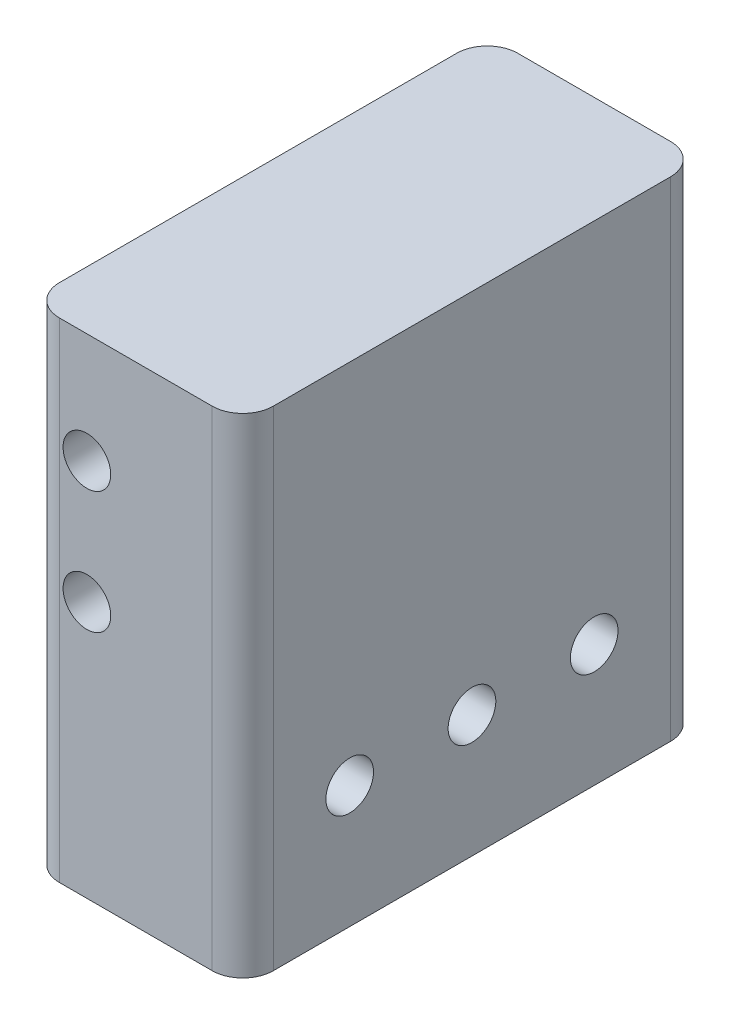
ISO-10303-21;
HEADER;
FILE_DESCRIPTION(('STEP AP214'),'2;1');
FILE_NAME('part.step','',(''),(''),'','','');
FILE_SCHEMA(('AUTOMOTIVE_DESIGN { 1 0 10303 214 1 1 1 1 }'));
ENDSEC;
DATA;
#1=APPLICATION_CONTEXT('core data for automotive mechanical design processes');
#2=APPLICATION_PROTOCOL_DEFINITION('international standard','automotive_design',2000,#1);
#3=PRODUCT_CONTEXT('',#1,'mechanical');
#4=PRODUCT('Part','Part','',(#3));
#5=PRODUCT_RELATED_PRODUCT_CATEGORY('part','',(#4));
#6=PRODUCT_DEFINITION_FORMATION('','',#4);
#7=PRODUCT_DEFINITION_CONTEXT('part definition',#1,'design');
#8=PRODUCT_DEFINITION('design','',#6,#7);
#9=PRODUCT_DEFINITION_SHAPE('','',#8);
#10=(LENGTH_UNIT() NAMED_UNIT(*) SI_UNIT(.MILLI.,.METRE.));
#11=(NAMED_UNIT(*) PLANE_ANGLE_UNIT() SI_UNIT($,.RADIAN.));
#12=(NAMED_UNIT(*) SI_UNIT($,.STERADIAN.) SOLID_ANGLE_UNIT());
#13=UNCERTAINTY_MEASURE_WITH_UNIT(LENGTH_MEASURE(1.E-05),#10,'distance_accuracy_value','');
#14=(GEOMETRIC_REPRESENTATION_CONTEXT(3) GLOBAL_UNCERTAINTY_ASSIGNED_CONTEXT((#13)) GLOBAL_UNIT_ASSIGNED_CONTEXT((#10,
#11,#12)) REPRESENTATION_CONTEXT('',''));
#15=CARTESIAN_POINT('',(0.,0.,0.));
#16=DIRECTION('',(0.,0.,1.));
#17=DIRECTION('',(1.,0.,0.));
#18=AXIS2_PLACEMENT_3D('',#15,#16,#17);
#19=CARTESIAN_POINT('',(23.8125,50.8,-49.2124999999999));
#20=DIRECTION('',(0.,0.,1.));
#21=DIRECTION('',(1.,0.,0.));
#22=AXIS2_PLACEMENT_3D('',#19,#20,#21);
#23=PLANE('',#22);
#24=CARTESIAN_POINT('',(7.62,26.67,-49.2124999999999));
#25=DIRECTION('',(0.,0.,1.));
#26=DIRECTION('',(1.,0.,0.));
#27=AXIS2_PLACEMENT_3D('',#24,#25,#26);
#28=CIRCLE('',#27,2.4765);
#29=CARTESIAN_POINT('',(10.0965,26.67,-49.2124999999999));
#30=VERTEX_POINT('',#29);
#31=EDGE_CURVE('E175',#30,#30,#28,.F.);
#32=ORIENTED_EDGE('',*,*,#31,.F.);
#33=EDGE_LOOP('',(#32));
#34=FACE_BOUND('',#33,.T.);
#35=CARTESIAN_POINT('',(7.62,39.37,-49.2124999999999));
#36=DIRECTION('',(0.,0.,1.));
#37=DIRECTION('',(1.,0.,0.));
#38=AXIS2_PLACEMENT_3D('',#35,#36,#37);
#39=CIRCLE('',#38,2.4765);
#40=CARTESIAN_POINT('',(10.0965,39.37,-49.2124999999999));
#41=VERTEX_POINT('',#40);
#42=EDGE_CURVE('E250',#41,#41,#39,.F.);
#43=ORIENTED_EDGE('',*,*,#42,.F.);
#44=EDGE_LOOP('',(#43));
#45=FACE_BOUND('',#44,.T.);
#46=DIRECTION('',(-1.,0.,0.));
#47=VECTOR('',#46,1.);
#48=CARTESIAN_POINT('',(23.8125,0.,-49.2124999999999));
#49=LINE('',#48,#47);
#50=CARTESIAN_POINT('',(20.6375,0.,-49.2124999999999));
#51=VERTEX_POINT('',#50);
#52=CARTESIAN_POINT('',(4.76249999999999,0.,-49.2124999999999));
#53=VERTEX_POINT('',#52);
#54=EDGE_CURVE('E166',#51,#53,#49,.T.);
#55=ORIENTED_EDGE('',*,*,#54,.T.);
#56=DIRECTION('',(0.,1.,0.));
#57=VECTOR('',#56,1.);
#58=CARTESIAN_POINT('',(4.76249999999999,50.8,-49.2124999999999));
#59=LINE('',#58,#57);
#60=CARTESIAN_POINT('',(4.76249999999999,50.8,-49.2124999999999));
#61=VERTEX_POINT('',#60);
#62=EDGE_CURVE('E122',#53,#61,#59,.T.);
#63=ORIENTED_EDGE('',*,*,#62,.T.);
#64=DIRECTION('',(-1.,0.,0.));
#65=VECTOR('',#64,1.);
#66=CARTESIAN_POINT('',(23.8125,50.8,-49.2124999999999));
#67=LINE('',#66,#65);
#68=CARTESIAN_POINT('',(20.6375,50.8,-49.2124999999999));
#69=VERTEX_POINT('',#68);
#70=EDGE_CURVE('E106',#69,#61,#67,.T.);
#71=ORIENTED_EDGE('',*,*,#70,.F.);
#72=DIRECTION('',(0.,1.,0.));
#73=VECTOR('',#72,1.);
#74=CARTESIAN_POINT('',(20.6375,50.8,-49.2124999999999));
#75=LINE('',#74,#73);
#76=EDGE_CURVE('E119',#69,#51,#75,.F.);
#77=ORIENTED_EDGE('',*,*,#76,.T.);
#78=EDGE_LOOP('',(#55,#63,#71,#77));
#79=FACE_BOUND('',#78,.T.);
#80=ADVANCED_FACE('F37',(#34,#45,#79),#23,.F.);
#81=CARTESIAN_POINT('',(23.8125,50.8,-49.2124999999999));
#82=DIRECTION('',(0.,-1.,0.));
#83=DIRECTION('',(0.,0.,-1.));
#84=AXIS2_PLACEMENT_3D('',#81,#82,#83);
#85=PLANE('',#84);
#86=ORIENTED_EDGE('',*,*,#70,.T.);
#87=CARTESIAN_POINT('',(4.76249999999999,50.8,-46.0374999999999));
#88=DIRECTION('',(0.,-1.,0.));
#89=DIRECTION('',(0.,0.,-1.));
#90=AXIS2_PLACEMENT_3D('',#87,#88,#89);
#91=CIRCLE('',#90,3.175);
#92=CARTESIAN_POINT('',(1.58749999999999,50.8,-46.0374999999999));
#93=VERTEX_POINT('',#92);
#94=EDGE_CURVE('E113',#61,#93,#91,.F.);
#95=ORIENTED_EDGE('',*,*,#94,.T.);
#96=DIRECTION('',(0.,0.,1.));
#97=VECTOR('',#96,1.);
#98=CARTESIAN_POINT('',(1.58749999999999,50.8,-49.2124999999999));
#99=LINE('',#98,#97);
#100=CARTESIAN_POINT('',(1.5875,50.8,-4.7625));
#101=VERTEX_POINT('',#100);
#102=EDGE_CURVE('E173',#93,#101,#99,.T.);
#103=ORIENTED_EDGE('',*,*,#102,.T.);
#104=CARTESIAN_POINT('',(4.7625,50.8,-4.76250000000001));
#105=DIRECTION('',(0.,-1.,0.));
#106=DIRECTION('',(0.,0.,-1.));
#107=AXIS2_PLACEMENT_3D('',#104,#105,#106);
#108=CIRCLE('',#107,3.175);
#109=CARTESIAN_POINT('',(4.7625,50.8,-1.58750000000001));
#110=VERTEX_POINT('',#109);
#111=EDGE_CURVE('E114',#101,#110,#108,.F.);
#112=ORIENTED_EDGE('',*,*,#111,.T.);
#113=DIRECTION('',(-1.,0.,0.));
#114=VECTOR('',#113,1.);
#115=CARTESIAN_POINT('',(23.8125,50.8,-1.58750000000001));
#116=LINE('',#115,#114);
#117=CARTESIAN_POINT('',(20.6375,50.8,-1.58750000000001));
#118=VERTEX_POINT('',#117);
#119=EDGE_CURVE('E123',#118,#110,#116,.T.);
#120=ORIENTED_EDGE('',*,*,#119,.F.);
#121=CARTESIAN_POINT('',(20.6375,50.8,-4.76250000000001));
#122=DIRECTION('',(0.,-1.,0.));
#123=DIRECTION('',(0.,0.,-1.));
#124=AXIS2_PLACEMENT_3D('',#121,#122,#123);
#125=CIRCLE('',#124,3.175);
#126=CARTESIAN_POINT('',(23.8125,50.8,-4.76250000000001));
#127=VERTEX_POINT('',#126);
#128=EDGE_CURVE('E129',#118,#127,#125,.F.);
#129=ORIENTED_EDGE('',*,*,#128,.T.);
#130=DIRECTION('',(0.,0.,1.));
#131=VECTOR('',#130,1.);
#132=CARTESIAN_POINT('',(23.8125,50.8,-49.2124999999999));
#133=LINE('',#132,#131);
#134=CARTESIAN_POINT('',(23.8125,50.8,-46.0374999999999));
#135=VERTEX_POINT('',#134);
#136=EDGE_CURVE('E108',#135,#127,#133,.T.);
#137=ORIENTED_EDGE('',*,*,#136,.F.);
#138=CARTESIAN_POINT('',(20.6375,50.8,-46.0374999999999));
#139=DIRECTION('',(0.,-1.,0.));
#140=DIRECTION('',(0.,0.,-1.));
#141=AXIS2_PLACEMENT_3D('',#138,#139,#140);
#142=CIRCLE('',#141,3.175);
#143=EDGE_CURVE('E103',#135,#69,#142,.F.);
#144=ORIENTED_EDGE('',*,*,#143,.T.);
#145=EDGE_LOOP('',(#86,#95,#103,#112,#120,#129,#137,#144));
#146=FACE_BOUND('',#145,.T.);
#147=ADVANCED_FACE('F105',(#146),#85,.F.);
#148=CARTESIAN_POINT('',(23.8125,50.8,-1.58750000000001));
#149=DIRECTION('',(0.,0.,-1.));
#150=DIRECTION('',(-1.,0.,0.));
#151=AXIS2_PLACEMENT_3D('',#148,#149,#150);
#152=PLANE('',#151);
#153=CARTESIAN_POINT('',(7.62,26.67,-1.58750000000001));
#154=DIRECTION('',(0.,0.,1.));
#155=DIRECTION('',(1.,0.,0.));
#156=AXIS2_PLACEMENT_3D('',#153,#154,#155);
#157=CIRCLE('',#156,2.4765);
#158=CARTESIAN_POINT('',(10.0965,26.67,-1.58750000000001));
#159=VERTEX_POINT('',#158);
#160=EDGE_CURVE('E245',#159,#159,#157,.T.);
#161=ORIENTED_EDGE('',*,*,#160,.F.);
#162=EDGE_LOOP('',(#161));
#163=FACE_BOUND('',#162,.T.);
#164=CARTESIAN_POINT('',(7.62,39.37,-1.58750000000001));
#165=DIRECTION('',(0.,0.,1.));
#166=DIRECTION('',(1.,0.,0.));
#167=AXIS2_PLACEMENT_3D('',#164,#165,#166);
#168=CIRCLE('',#167,2.4765);
#169=CARTESIAN_POINT('',(10.0965,39.37,-1.58750000000001));
#170=VERTEX_POINT('',#169);
#171=EDGE_CURVE('E248',#170,#170,#168,.T.);
#172=ORIENTED_EDGE('',*,*,#171,.F.);
#173=EDGE_LOOP('',(#172));
#174=FACE_BOUND('',#173,.T.);
#175=ORIENTED_EDGE('',*,*,#119,.T.);
#176=DIRECTION('',(0.,-1.,0.));
#177=VECTOR('',#176,1.);
#178=CARTESIAN_POINT('',(4.7625,0.,-1.58750000000001));
#179=LINE('',#178,#177);
#180=CARTESIAN_POINT('',(4.7625,0.,-1.58750000000001));
#181=VERTEX_POINT('',#180);
#182=EDGE_CURVE('E11',#110,#181,#179,.T.);
#183=ORIENTED_EDGE('',*,*,#182,.T.);
#184=DIRECTION('',(-1.,0.,0.));
#185=VECTOR('',#184,1.);
#186=CARTESIAN_POINT('',(23.8125,0.,-1.58750000000001));
#187=LINE('',#186,#185);
#188=CARTESIAN_POINT('',(20.6375,0.,-1.58750000000001));
#189=VERTEX_POINT('',#188);
#190=EDGE_CURVE('E154',#189,#181,#187,.T.);
#191=ORIENTED_EDGE('',*,*,#190,.F.);
#192=DIRECTION('',(0.,-1.,0.));
#193=VECTOR('',#192,1.);
#194=CARTESIAN_POINT('',(20.6375,50.8,-1.58750000000001));
#195=LINE('',#194,#193);
#196=EDGE_CURVE('E45',#189,#118,#195,.F.);
#197=ORIENTED_EDGE('',*,*,#196,.T.);
#198=EDGE_LOOP('',(#175,#183,#191,#197));
#199=FACE_BOUND('',#198,.T.);
#200=ADVANCED_FACE('F153',(#163,#174,#199),#152,.F.);
#201=CARTESIAN_POINT('',(23.8125,0.,-49.2124999999999));
#202=DIRECTION('',(0.,1.,0.));
#203=DIRECTION('',(0.,0.,1.));
#204=AXIS2_PLACEMENT_3D('',#201,#202,#203);
#205=PLANE('',#204);
#206=DIRECTION('',(0.,0.,-1.));
#207=VECTOR('',#206,1.);
#208=CARTESIAN_POINT('',(1.58749999999999,0.,-49.2124999999999));
#209=LINE('',#208,#207);
#210=CARTESIAN_POINT('',(1.5875,0.,-4.7625));
#211=VERTEX_POINT('',#210);
#212=CARTESIAN_POINT('',(1.58749999999999,0.,-46.0374999999999));
#213=VERTEX_POINT('',#212);
#214=EDGE_CURVE('E169',#211,#213,#209,.T.);
#215=ORIENTED_EDGE('',*,*,#214,.T.);
#216=CARTESIAN_POINT('',(4.76249999999999,0.,-46.0374999999999));
#217=DIRECTION('',(0.,1.,0.));
#218=DIRECTION('',(0.,0.,1.));
#219=AXIS2_PLACEMENT_3D('',#216,#217,#218);
#220=CIRCLE('',#219,3.175);
#221=EDGE_CURVE('E143',#213,#53,#220,.F.);
#222=ORIENTED_EDGE('',*,*,#221,.T.);
#223=ORIENTED_EDGE('',*,*,#54,.F.);
#224=CARTESIAN_POINT('',(20.6375,0.,-46.0374999999999));
#225=DIRECTION('',(0.,1.,0.));
#226=DIRECTION('',(0.,0.,1.));
#227=AXIS2_PLACEMENT_3D('',#224,#225,#226);
#228=CIRCLE('',#227,3.175);
#229=CARTESIAN_POINT('',(23.8125,0.,-46.0374999999999));
#230=VERTEX_POINT('',#229);
#231=EDGE_CURVE('E127',#51,#230,#228,.F.);
#232=ORIENTED_EDGE('',*,*,#231,.T.);
#233=DIRECTION('',(0.,0.,-1.));
#234=VECTOR('',#233,1.);
#235=CARTESIAN_POINT('',(23.8125,0.,-49.2124999999999));
#236=LINE('',#235,#234);
#237=CARTESIAN_POINT('',(23.8125,0.,-4.76250000000001));
#238=VERTEX_POINT('',#237);
#239=EDGE_CURVE('E163',#238,#230,#236,.T.);
#240=ORIENTED_EDGE('',*,*,#239,.F.);
#241=CARTESIAN_POINT('',(20.6375,0.,-4.76250000000001));
#242=DIRECTION('',(0.,1.,0.));
#243=DIRECTION('',(0.,0.,1.));
#244=AXIS2_PLACEMENT_3D('',#241,#242,#243);
#245=CIRCLE('',#244,3.175);
#246=EDGE_CURVE('E59',#238,#189,#245,.F.);
#247=ORIENTED_EDGE('',*,*,#246,.T.);
#248=ORIENTED_EDGE('',*,*,#190,.T.);
#249=CARTESIAN_POINT('',(4.7625,0.,-4.76250000000001));
#250=DIRECTION('',(0.,1.,0.));
#251=DIRECTION('',(0.,0.,1.));
#252=AXIS2_PLACEMENT_3D('',#249,#250,#251);
#253=CIRCLE('',#252,3.175);
#254=EDGE_CURVE('E52',#181,#211,#253,.F.);
#255=ORIENTED_EDGE('',*,*,#254,.T.);
#256=EDGE_LOOP('',(#215,#222,#223,#232,#240,#247,#248,#255));
#257=FACE_BOUND('',#256,.T.);
#258=ADVANCED_FACE('F165',(#257),#205,.F.);
#259=CARTESIAN_POINT('',(23.8125,0.,0.));
#260=DIRECTION('',(-1.,0.,0.));
#261=DIRECTION('',(0.,0.,1.));
#262=AXIS2_PLACEMENT_3D('',#259,#260,#261);
#263=PLANE('',#262);
#264=CARTESIAN_POINT('',(23.8125,12.7,-12.6999999999999));
#265=DIRECTION('',(-1.,0.,0.));
#266=DIRECTION('',(0.,0.,1.));
#267=AXIS2_PLACEMENT_3D('',#264,#265,#266);
#268=CIRCLE('',#267,2.4765);
#269=CARTESIAN_POINT('',(23.8125,12.7,-10.2234999999999));
#270=VERTEX_POINT('',#269);
#271=EDGE_CURVE('E253',#270,#270,#268,.F.);
#272=ORIENTED_EDGE('',*,*,#271,.F.);
#273=EDGE_LOOP('',(#272));
#274=FACE_BOUND('',#273,.T.);
#275=CARTESIAN_POINT('',(23.8125,12.7,-25.3999999999999));
#276=DIRECTION('',(-1.,0.,0.));
#277=DIRECTION('',(0.,0.,1.));
#278=AXIS2_PLACEMENT_3D('',#275,#276,#277);
#279=CIRCLE('',#278,2.4765);
#280=CARTESIAN_POINT('',(23.8125,12.7,-22.9234999999999));
#281=VERTEX_POINT('',#280);
#282=EDGE_CURVE('E261',#281,#281,#279,.F.);
#283=ORIENTED_EDGE('',*,*,#282,.F.);
#284=EDGE_LOOP('',(#283));
#285=FACE_BOUND('',#284,.T.);
#286=CARTESIAN_POINT('',(23.8125,12.7,-38.0999999999999));
#287=DIRECTION('',(-1.,0.,0.));
#288=DIRECTION('',(0.,0.,1.));
#289=AXIS2_PLACEMENT_3D('',#286,#287,#288);
#290=CIRCLE('',#289,2.4765);
#291=CARTESIAN_POINT('',(23.8125,12.7,-35.6234999999999));
#292=VERTEX_POINT('',#291);
#293=EDGE_CURVE('E262',#292,#292,#290,.F.);
#294=ORIENTED_EDGE('',*,*,#293,.F.);
#295=EDGE_LOOP('',(#294));
#296=FACE_BOUND('',#295,.T.);
#297=ORIENTED_EDGE('',*,*,#239,.T.);
#298=DIRECTION('',(0.,1.,0.));
#299=VECTOR('',#298,1.);
#300=CARTESIAN_POINT('',(23.8125,0.,-46.0374999999999));
#301=LINE('',#300,#299);
#302=EDGE_CURVE('E148',#230,#135,#301,.T.);
#303=ORIENTED_EDGE('',*,*,#302,.T.);
#304=ORIENTED_EDGE('',*,*,#136,.T.);
#305=DIRECTION('',(0.,-1.,0.));
#306=VECTOR('',#305,1.);
#307=CARTESIAN_POINT('',(23.8125,0.,-4.76250000000001));
#308=LINE('',#307,#306);
#309=EDGE_CURVE('E145',#127,#238,#308,.T.);
#310=ORIENTED_EDGE('',*,*,#309,.T.);
#311=EDGE_LOOP('',(#297,#303,#304,#310));
#312=FACE_BOUND('',#311,.T.);
#313=ADVANCED_FACE('F162',(#274,#285,#296,#312),#263,.F.);
#314=CARTESIAN_POINT('',(1.5875,0.,0.));
#315=DIRECTION('',(-1.,0.,0.));
#316=DIRECTION('',(0.,0.,1.));
#317=AXIS2_PLACEMENT_3D('',#314,#315,#316);
#318=PLANE('',#317);
#319=CARTESIAN_POINT('',(1.5875,12.7,-12.6999999999999));
#320=DIRECTION('',(-1.,0.,0.));
#321=DIRECTION('',(0.,0.,1.));
#322=AXIS2_PLACEMENT_3D('',#319,#320,#321);
#323=CIRCLE('',#322,2.4765);
#324=CARTESIAN_POINT('',(1.5875,12.7,-10.2234999999999));
#325=VERTEX_POINT('',#324);
#326=EDGE_CURVE('E268',#325,#325,#323,.T.);
#327=ORIENTED_EDGE('',*,*,#326,.F.);
#328=EDGE_LOOP('',(#327));
#329=FACE_BOUND('',#328,.T.);
#330=CARTESIAN_POINT('',(1.5875,12.7,-25.3999999999999));
#331=DIRECTION('',(-1.,0.,0.));
#332=DIRECTION('',(0.,0.,1.));
#333=AXIS2_PLACEMENT_3D('',#330,#331,#332);
#334=CIRCLE('',#333,2.4765);
#335=CARTESIAN_POINT('',(1.5875,12.7,-22.9234999999999));
#336=VERTEX_POINT('',#335);
#337=EDGE_CURVE('E265',#336,#336,#334,.T.);
#338=ORIENTED_EDGE('',*,*,#337,.F.);
#339=EDGE_LOOP('',(#338));
#340=FACE_BOUND('',#339,.T.);
#341=CARTESIAN_POINT('',(1.5875,12.7,-38.0999999999999));
#342=DIRECTION('',(-1.,0.,0.));
#343=DIRECTION('',(0.,0.,1.));
#344=AXIS2_PLACEMENT_3D('',#341,#342,#343);
#345=CIRCLE('',#344,2.4765);
#346=CARTESIAN_POINT('',(1.5875,12.7,-35.6234999999999));
#347=VERTEX_POINT('',#346);
#348=EDGE_CURVE('E258',#347,#347,#345,.T.);
#349=ORIENTED_EDGE('',*,*,#348,.F.);
#350=EDGE_LOOP('',(#349));
#351=FACE_BOUND('',#350,.T.);
#352=ORIENTED_EDGE('',*,*,#102,.F.);
#353=DIRECTION('',(0.,1.,0.));
#354=VECTOR('',#353,1.);
#355=CARTESIAN_POINT('',(1.58749999999999,0.,-46.0374999999999));
#356=LINE('',#355,#354);
#357=EDGE_CURVE('E138',#93,#213,#356,.F.);
#358=ORIENTED_EDGE('',*,*,#357,.T.);
#359=ORIENTED_EDGE('',*,*,#214,.F.);
#360=DIRECTION('',(0.,-1.,0.));
#361=VECTOR('',#360,1.);
#362=CARTESIAN_POINT('',(1.5875,50.8,-4.76250000000001));
#363=LINE('',#362,#361);
#364=EDGE_CURVE('E136',#211,#101,#363,.F.);
#365=ORIENTED_EDGE('',*,*,#364,.T.);
#366=EDGE_LOOP('',(#352,#358,#359,#365));
#367=FACE_BOUND('',#366,.T.);
#368=ADVANCED_FACE('F181',(#329,#340,#351,#367),#318,.T.);
#369=CARTESIAN_POINT('',(7.62,39.37,-56.2170997744339));
#370=DIRECTION('',(0.,0.,1.));
#371=DIRECTION('',(1.,0.,0.));
#372=AXIS2_PLACEMENT_3D('',#369,#370,#371);
#373=CYLINDRICAL_SURFACE('',#372,2.4765);
#374=CARTESIAN_POINT('',(10.0965,39.37,-49.2124999999999));
#375=CARTESIAN_POINT('',(10.0965,39.37,-48.7164062499999));
#376=CARTESIAN_POINT('',(10.0965,39.37,-48.2203124999999));
#377=CARTESIAN_POINT('',(10.0965,39.37,-47.2281249999999));
#378=CARTESIAN_POINT('',(10.0965,39.37,-46.7320312499999));
#379=CARTESIAN_POINT('',(10.0965,39.37,-45.7398437499999));
#380=CARTESIAN_POINT('',(10.0965,39.37,-45.2437499999999));
#381=CARTESIAN_POINT('',(10.0965,39.37,-44.2515624999999));
#382=CARTESIAN_POINT('',(10.0965,39.37,-43.7554687499999));
#383=CARTESIAN_POINT('',(10.0965,39.37,-42.7632812499999));
#384=CARTESIAN_POINT('',(10.0965,39.37,-42.2671874999999));
#385=CARTESIAN_POINT('',(10.0965,39.37,-41.2749999999999));
#386=CARTESIAN_POINT('',(10.0965,39.37,-40.7789062499999));
#387=CARTESIAN_POINT('',(10.0965,39.37,-39.7867187499999));
#388=CARTESIAN_POINT('',(10.0965,39.37,-39.2906249999999));
#389=CARTESIAN_POINT('',(10.0965,39.37,-38.2984374999999));
#390=CARTESIAN_POINT('',(10.0965,39.37,-37.8023437499999));
#391=CARTESIAN_POINT('',(10.0965,39.37,-36.8101562499999));
#392=CARTESIAN_POINT('',(10.0965,39.37,-36.3140624999999));
#393=CARTESIAN_POINT('',(10.0965,39.37,-35.3218749999999));
#394=CARTESIAN_POINT('',(10.0965,39.37,-34.8257812499999));
#395=CARTESIAN_POINT('',(10.0965,39.37,-33.8335937499999));
#396=CARTESIAN_POINT('',(10.0965,39.37,-33.3374999999999));
#397=CARTESIAN_POINT('',(10.0965,39.37,-32.3453124999999));
#398=CARTESIAN_POINT('',(10.0965,39.37,-31.8492187499999));
#399=CARTESIAN_POINT('',(10.0965,39.37,-30.8570312499999));
#400=CARTESIAN_POINT('',(10.0965,39.37,-30.3609374999999));
#401=CARTESIAN_POINT('',(10.0965,39.37,-29.3687499999999));
#402=CARTESIAN_POINT('',(10.0965,39.37,-28.87265625));
#403=CARTESIAN_POINT('',(10.0965,39.37,-27.88046875));
#404=CARTESIAN_POINT('',(10.0965,39.37,-27.384375));
#405=CARTESIAN_POINT('',(10.0965,39.37,-26.3921875));
#406=CARTESIAN_POINT('',(10.0965,39.37,-25.89609375));
#407=CARTESIAN_POINT('',(10.0965,39.37,-24.90390625));
#408=CARTESIAN_POINT('',(10.0965,39.37,-24.4078125));
#409=CARTESIAN_POINT('',(10.0965,39.37,-23.415625));
#410=CARTESIAN_POINT('',(10.0965,39.37,-22.91953125));
#411=CARTESIAN_POINT('',(10.0965,39.37,-21.92734375));
#412=CARTESIAN_POINT('',(10.0965,39.37,-21.43125));
#413=CARTESIAN_POINT('',(10.0965,39.37,-20.4390625));
#414=CARTESIAN_POINT('',(10.0965,39.37,-19.94296875));
#415=CARTESIAN_POINT('',(10.0965,39.37,-18.95078125));
#416=CARTESIAN_POINT('',(10.0965,39.37,-18.4546875));
#417=CARTESIAN_POINT('',(10.0965,39.37,-17.4625));
#418=CARTESIAN_POINT('',(10.0965,39.37,-16.96640625));
#419=CARTESIAN_POINT('',(10.0965,39.37,-15.97421875));
#420=CARTESIAN_POINT('',(10.0965,39.37,-15.478125));
#421=CARTESIAN_POINT('',(10.0965,39.37,-14.4859375));
#422=CARTESIAN_POINT('',(10.0965,39.37,-13.98984375));
#423=CARTESIAN_POINT('',(10.0965,39.37,-12.99765625));
#424=CARTESIAN_POINT('',(10.0965,39.37,-12.5015625));
#425=CARTESIAN_POINT('',(10.0965,39.37,-11.509375));
#426=CARTESIAN_POINT('',(10.0965,39.37,-11.01328125));
#427=CARTESIAN_POINT('',(10.0965,39.37,-10.02109375));
#428=CARTESIAN_POINT('',(10.0965,39.37,-9.525));
#429=CARTESIAN_POINT('',(10.0965,39.37,-8.5328125));
#430=CARTESIAN_POINT('',(10.0965,39.37,-8.03671875));
#431=CARTESIAN_POINT('',(10.0965,39.37,-7.04453125));
#432=CARTESIAN_POINT('',(10.0965,39.37,-6.5484375));
#433=CARTESIAN_POINT('',(10.0965,39.37,-5.55625000000001));
#434=CARTESIAN_POINT('',(10.0965,39.37,-5.06015625000001));
#435=CARTESIAN_POINT('',(10.0965,39.37,-4.06796875000001));
#436=CARTESIAN_POINT('',(10.0965,39.37,-3.57187500000001));
#437=CARTESIAN_POINT('',(10.0965,39.37,-2.57968750000001));
#438=CARTESIAN_POINT('',(10.0965,39.37,-2.08359375000001));
#439=CARTESIAN_POINT('',(10.0965,39.37,-1.58750000000001));
#440=B_SPLINE_CURVE_WITH_KNOTS('',3,(#374,#375,#376,#377,#378,#379,#380,#381,#382,#383,#384,
#385,#386,#387,#388,#389,#390,#391,#392,#393,#394,#395,#396,#397,#398,#399,#400,#401,#402,#403,
#404,#405,#406,#407,#408,#409,#410,#411,#412,#413,#414,#415,#416,#417,#418,#419,#420,#421,#422,
#423,#424,#425,#426,#427,#428,#429,#430,#431,#432,#433,#434,#435,#436,#437,#438,#439),
.UNSPECIFIED.,.F.,.F.,(4,2,2,2,2,2,2,2,2,2,2,2,2,2,2,2,2,2,2,2,2,2,2,2,2,2,2,2,2,2,2,2,4),(0.,
1.48828125,2.97656249999999,4.46484374999999,5.95312499999999,7.44140624999998,8.92968749999998,
10.41796875,11.90625,13.39453125,14.8828125,16.37109375,17.859375,19.34765625,20.8359375,
22.3242187499999,23.8124999999999,25.3007812499999,26.7890624999999,28.2773437499999,
29.7656249999999,31.2539062499999,32.7421874999999,34.2304687499999,35.7187499999999,
37.2070312499999,38.6953124999999,40.1835937499999,41.6718749999999,43.1601562499999,
44.6484374999999,46.1367187499999,47.6249999999999),.UNSPECIFIED.);
#441=EDGE_CURVE('BSEAM226',#41,#170,#440,.T.);
#442=ORIENTED_EDGE('',*,*,#42,.T.);
#443=ORIENTED_EDGE('',*,*,#171,.T.);
#444=ORIENTED_EDGE('',*,*,#441,.T.);
#445=ORIENTED_EDGE('',*,*,#441,.F.);
#446=EDGE_LOOP('',(#442,#444,#443,#445));
#447=FACE_BOUND('',#446,.T.);
#448=ADVANCED_FACE('F226',(#447),#373,.F.);
#449=CARTESIAN_POINT('',(7.62,26.67,-56.2170997744339));
#450=DIRECTION('',(0.,0.,1.));
#451=DIRECTION('',(1.,0.,0.));
#452=AXIS2_PLACEMENT_3D('',#449,#450,#451);
#453=CYLINDRICAL_SURFACE('',#452,2.4765);
#454=CARTESIAN_POINT('',(10.0965,26.67,-49.2124999999999));
#455=CARTESIAN_POINT('',(10.0965,26.67,-48.7164062499999));
#456=CARTESIAN_POINT('',(10.0965,26.67,-48.2203124999999));
#457=CARTESIAN_POINT('',(10.0965,26.67,-47.2281249999999));
#458=CARTESIAN_POINT('',(10.0965,26.67,-46.7320312499999));
#459=CARTESIAN_POINT('',(10.0965,26.67,-45.7398437499999));
#460=CARTESIAN_POINT('',(10.0965,26.67,-45.2437499999999));
#461=CARTESIAN_POINT('',(10.0965,26.67,-44.2515624999999));
#462=CARTESIAN_POINT('',(10.0965,26.67,-43.7554687499999));
#463=CARTESIAN_POINT('',(10.0965,26.67,-42.7632812499999));
#464=CARTESIAN_POINT('',(10.0965,26.67,-42.2671874999999));
#465=CARTESIAN_POINT('',(10.0965,26.67,-41.2749999999999));
#466=CARTESIAN_POINT('',(10.0965,26.67,-40.7789062499999));
#467=CARTESIAN_POINT('',(10.0965,26.67,-39.7867187499999));
#468=CARTESIAN_POINT('',(10.0965,26.67,-39.2906249999999));
#469=CARTESIAN_POINT('',(10.0965,26.67,-38.2984374999999));
#470=CARTESIAN_POINT('',(10.0965,26.67,-37.8023437499999));
#471=CARTESIAN_POINT('',(10.0965,26.67,-36.8101562499999));
#472=CARTESIAN_POINT('',(10.0965,26.67,-36.3140624999999));
#473=CARTESIAN_POINT('',(10.0965,26.67,-35.3218749999999));
#474=CARTESIAN_POINT('',(10.0965,26.67,-34.8257812499999));
#475=CARTESIAN_POINT('',(10.0965,26.67,-33.8335937499999));
#476=CARTESIAN_POINT('',(10.0965,26.67,-33.3374999999999));
#477=CARTESIAN_POINT('',(10.0965,26.67,-32.3453124999999));
#478=CARTESIAN_POINT('',(10.0965,26.67,-31.8492187499999));
#479=CARTESIAN_POINT('',(10.0965,26.67,-30.8570312499999));
#480=CARTESIAN_POINT('',(10.0965,26.67,-30.3609374999999));
#481=CARTESIAN_POINT('',(10.0965,26.67,-29.3687499999999));
#482=CARTESIAN_POINT('',(10.0965,26.67,-28.87265625));
#483=CARTESIAN_POINT('',(10.0965,26.67,-27.88046875));
#484=CARTESIAN_POINT('',(10.0965,26.67,-27.384375));
#485=CARTESIAN_POINT('',(10.0965,26.67,-26.3921875));
#486=CARTESIAN_POINT('',(10.0965,26.67,-25.89609375));
#487=CARTESIAN_POINT('',(10.0965,26.67,-24.90390625));
#488=CARTESIAN_POINT('',(10.0965,26.67,-24.4078125));
#489=CARTESIAN_POINT('',(10.0965,26.67,-23.415625));
#490=CARTESIAN_POINT('',(10.0965,26.67,-22.91953125));
#491=CARTESIAN_POINT('',(10.0965,26.67,-21.92734375));
#492=CARTESIAN_POINT('',(10.0965,26.67,-21.43125));
#493=CARTESIAN_POINT('',(10.0965,26.67,-20.4390625));
#494=CARTESIAN_POINT('',(10.0965,26.67,-19.94296875));
#495=CARTESIAN_POINT('',(10.0965,26.67,-18.95078125));
#496=CARTESIAN_POINT('',(10.0965,26.67,-18.4546875));
#497=CARTESIAN_POINT('',(10.0965,26.67,-17.4625));
#498=CARTESIAN_POINT('',(10.0965,26.67,-16.96640625));
#499=CARTESIAN_POINT('',(10.0965,26.67,-15.97421875));
#500=CARTESIAN_POINT('',(10.0965,26.67,-15.478125));
#501=CARTESIAN_POINT('',(10.0965,26.67,-14.4859375));
#502=CARTESIAN_POINT('',(10.0965,26.67,-13.98984375));
#503=CARTESIAN_POINT('',(10.0965,26.67,-12.99765625));
#504=CARTESIAN_POINT('',(10.0965,26.67,-12.5015625));
#505=CARTESIAN_POINT('',(10.0965,26.67,-11.509375));
#506=CARTESIAN_POINT('',(10.0965,26.67,-11.01328125));
#507=CARTESIAN_POINT('',(10.0965,26.67,-10.02109375));
#508=CARTESIAN_POINT('',(10.0965,26.67,-9.525));
#509=CARTESIAN_POINT('',(10.0965,26.67,-8.5328125));
#510=CARTESIAN_POINT('',(10.0965,26.67,-8.03671875));
#511=CARTESIAN_POINT('',(10.0965,26.67,-7.04453125));
#512=CARTESIAN_POINT('',(10.0965,26.67,-6.5484375));
#513=CARTESIAN_POINT('',(10.0965,26.67,-5.55625000000001));
#514=CARTESIAN_POINT('',(10.0965,26.67,-5.06015625000001));
#515=CARTESIAN_POINT('',(10.0965,26.67,-4.06796875000001));
#516=CARTESIAN_POINT('',(10.0965,26.67,-3.57187500000001));
#517=CARTESIAN_POINT('',(10.0965,26.67,-2.57968750000001));
#518=CARTESIAN_POINT('',(10.0965,26.67,-2.08359375000001));
#519=CARTESIAN_POINT('',(10.0965,26.67,-1.58750000000001));
#520=B_SPLINE_CURVE_WITH_KNOTS('',3,(#454,#455,#456,#457,#458,#459,#460,#461,#462,#463,#464,
#465,#466,#467,#468,#469,#470,#471,#472,#473,#474,#475,#476,#477,#478,#479,#480,#481,#482,#483,
#484,#485,#486,#487,#488,#489,#490,#491,#492,#493,#494,#495,#496,#497,#498,#499,#500,#501,#502,
#503,#504,#505,#506,#507,#508,#509,#510,#511,#512,#513,#514,#515,#516,#517,#518,#519),
.UNSPECIFIED.,.F.,.F.,(4,2,2,2,2,2,2,2,2,2,2,2,2,2,2,2,2,2,2,2,2,2,2,2,2,2,2,2,2,2,2,2,4),(0.,
1.48828125,2.97656249999999,4.46484374999999,5.95312499999999,7.44140624999998,8.92968749999998,
10.41796875,11.90625,13.39453125,14.8828125,16.37109375,17.859375,19.34765625,20.8359375,
22.3242187499999,23.8124999999999,25.3007812499999,26.7890624999999,28.2773437499999,
29.7656249999999,31.2539062499999,32.7421874999999,34.2304687499999,35.7187499999999,
37.2070312499999,38.6953124999999,40.1835937499999,41.6718749999999,43.1601562499999,
44.6484374999999,46.1367187499999,47.6249999999999),.UNSPECIFIED.);
#521=EDGE_CURVE('BSEAM222',#30,#159,#520,.T.);
#522=ORIENTED_EDGE('',*,*,#31,.T.);
#523=ORIENTED_EDGE('',*,*,#160,.T.);
#524=ORIENTED_EDGE('',*,*,#521,.T.);
#525=ORIENTED_EDGE('',*,*,#521,.F.);
#526=EDGE_LOOP('',(#522,#524,#523,#525));
#527=FACE_BOUND('',#526,.T.);
#528=ADVANCED_FACE('F222',(#527),#453,.F.);
#529=CARTESIAN_POINT('',(30.8170997744339,12.7,-38.0999999999999));
#530=DIRECTION('',(-1.,0.,0.));
#531=DIRECTION('',(0.,0.,1.));
#532=AXIS2_PLACEMENT_3D('',#529,#530,#531);
#533=CYLINDRICAL_SURFACE('',#532,2.4765);
#534=ORIENTED_EDGE('',*,*,#293,.T.);
#535=EDGE_LOOP('',(#534));
#536=FACE_BOUND('',#535,.T.);
#537=ORIENTED_EDGE('',*,*,#348,.T.);
#538=EDGE_LOOP('',(#537));
#539=FACE_BOUND('',#538,.T.);
#540=ADVANCED_FACE('F214',(#536,#539),#533,.F.);
#541=CARTESIAN_POINT('',(30.8170997744339,12.7,-25.3999999999999));
#542=DIRECTION('',(-1.,0.,0.));
#543=DIRECTION('',(0.,0.,1.));
#544=AXIS2_PLACEMENT_3D('',#541,#542,#543);
#545=CYLINDRICAL_SURFACE('',#544,2.4765);
#546=ORIENTED_EDGE('',*,*,#282,.T.);
#547=EDGE_LOOP('',(#546));
#548=FACE_BOUND('',#547,.T.);
#549=ORIENTED_EDGE('',*,*,#337,.T.);
#550=EDGE_LOOP('',(#549));
#551=FACE_BOUND('',#550,.T.);
#552=ADVANCED_FACE('F208',(#548,#551),#545,.F.);
#553=CARTESIAN_POINT('',(30.8170997744339,12.7,-12.6999999999999));
#554=DIRECTION('',(-1.,0.,0.));
#555=DIRECTION('',(0.,0.,1.));
#556=AXIS2_PLACEMENT_3D('',#553,#554,#555);
#557=CYLINDRICAL_SURFACE('',#556,2.4765);
#558=ORIENTED_EDGE('',*,*,#271,.T.);
#559=EDGE_LOOP('',(#558));
#560=FACE_BOUND('',#559,.T.);
#561=ORIENTED_EDGE('',*,*,#326,.T.);
#562=EDGE_LOOP('',(#561));
#563=FACE_BOUND('',#562,.T.);
#564=ADVANCED_FACE('F203',(#560,#563),#557,.F.);
#565=CARTESIAN_POINT('',(4.76249999999999,50.8,-46.0374999999999));
#566=DIRECTION('',(0.,-1.,0.));
#567=DIRECTION('',(0.,0.,-1.));
#568=AXIS2_PLACEMENT_3D('',#565,#566,#567);
#569=CYLINDRICAL_SURFACE('',#568,3.175);
#570=ORIENTED_EDGE('',*,*,#221,.F.);
#571=ORIENTED_EDGE('',*,*,#357,.F.);
#572=ORIENTED_EDGE('',*,*,#94,.F.);
#573=ORIENTED_EDGE('',*,*,#62,.F.);
#574=EDGE_LOOP('',(#570,#571,#572,#573));
#575=FACE_BOUND('',#574,.T.);
#576=ADVANCED_FACE('F189',(#575),#569,.T.);
#577=CARTESIAN_POINT('',(20.6375,0.,-46.0374999999999));
#578=DIRECTION('',(0.,1.,0.));
#579=DIRECTION('',(0.,0.,1.));
#580=AXIS2_PLACEMENT_3D('',#577,#578,#579);
#581=CYLINDRICAL_SURFACE('',#580,3.175);
#582=ORIENTED_EDGE('',*,*,#231,.F.);
#583=ORIENTED_EDGE('',*,*,#76,.F.);
#584=ORIENTED_EDGE('',*,*,#143,.F.);
#585=ORIENTED_EDGE('',*,*,#302,.F.);
#586=EDGE_LOOP('',(#582,#583,#584,#585));
#587=FACE_BOUND('',#586,.T.);
#588=ADVANCED_FACE('F126',(#587),#581,.T.);
#589=CARTESIAN_POINT('',(4.7625,50.8,-4.76250000000001));
#590=DIRECTION('',(0.,1.,0.));
#591=DIRECTION('',(0.,0.,1.));
#592=AXIS2_PLACEMENT_3D('',#589,#590,#591);
#593=CYLINDRICAL_SURFACE('',#592,3.175);
#594=ORIENTED_EDGE('',*,*,#111,.F.);
#595=ORIENTED_EDGE('',*,*,#364,.F.);
#596=ORIENTED_EDGE('',*,*,#254,.F.);
#597=ORIENTED_EDGE('',*,*,#182,.F.);
#598=EDGE_LOOP('',(#594,#595,#596,#597));
#599=FACE_BOUND('',#598,.T.);
#600=ADVANCED_FACE('F183',(#599),#593,.T.);
#601=CARTESIAN_POINT('',(20.6375,0.,-4.76250000000001));
#602=DIRECTION('',(0.,-1.,0.));
#603=DIRECTION('',(0.,0.,-1.));
#604=AXIS2_PLACEMENT_3D('',#601,#602,#603);
#605=CYLINDRICAL_SURFACE('',#604,3.175);
#606=ORIENTED_EDGE('',*,*,#128,.F.);
#607=ORIENTED_EDGE('',*,*,#196,.F.);
#608=ORIENTED_EDGE('',*,*,#246,.F.);
#609=ORIENTED_EDGE('',*,*,#309,.F.);
#610=EDGE_LOOP('',(#606,#607,#608,#609));
#611=FACE_BOUND('',#610,.T.);
#612=ADVANCED_FACE('F39',(#611),#605,.T.);
#613=CLOSED_SHELL('',(#80,#147,#200,#258,#313,#368,#448,#528,#540,#552,#564,#576,#588,#600,#612));
#614=MANIFOLD_SOLID_BREP('B2',#613);
#615=ADVANCED_BREP_SHAPE_REPRESENTATION('',(#18,#614),#14);
#616=SHAPE_DEFINITION_REPRESENTATION(#9,#615);
ENDSEC;
END-ISO-10303-21;
